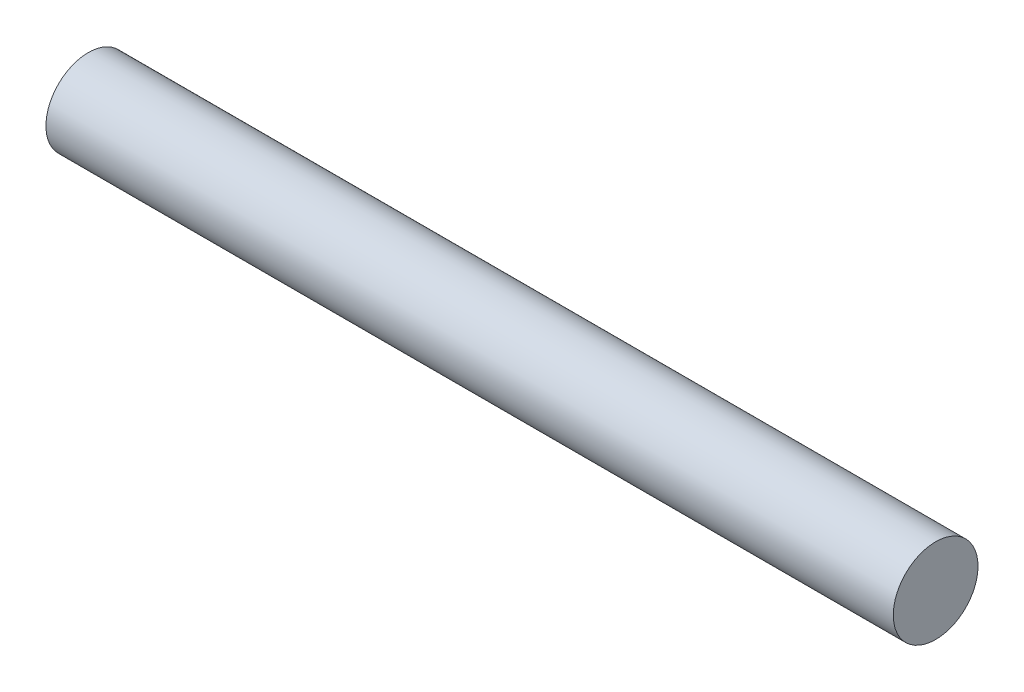
ISO-10303-21;
HEADER;
FILE_DESCRIPTION(('STEP AP214'),'2;1');
FILE_NAME('part.step','',(''),(''),'','','');
FILE_SCHEMA(('AUTOMOTIVE_DESIGN { 1 0 10303 214 1 1 1 1 }'));
ENDSEC;
DATA;
#1=APPLICATION_CONTEXT('core data for automotive mechanical design processes');
#2=APPLICATION_PROTOCOL_DEFINITION('international standard','automotive_design',2000,#1);
#3=PRODUCT_CONTEXT('',#1,'mechanical');
#4=PRODUCT('Part','Part','',(#3));
#5=PRODUCT_RELATED_PRODUCT_CATEGORY('part','',(#4));
#6=PRODUCT_DEFINITION_FORMATION('','',#4);
#7=PRODUCT_DEFINITION_CONTEXT('part definition',#1,'design');
#8=PRODUCT_DEFINITION('design','',#6,#7);
#9=PRODUCT_DEFINITION_SHAPE('','',#8);
#10=(LENGTH_UNIT() NAMED_UNIT(*) SI_UNIT(.MILLI.,.METRE.));
#11=(NAMED_UNIT(*) PLANE_ANGLE_UNIT() SI_UNIT($,.RADIAN.));
#12=(NAMED_UNIT(*) SI_UNIT($,.STERADIAN.) SOLID_ANGLE_UNIT());
#13=UNCERTAINTY_MEASURE_WITH_UNIT(LENGTH_MEASURE(1.E-05),#10,'distance_accuracy_value','');
#14=(GEOMETRIC_REPRESENTATION_CONTEXT(3) GLOBAL_UNCERTAINTY_ASSIGNED_CONTEXT((#13)) GLOBAL_UNIT_ASSIGNED_CONTEXT((#10,
#11,#12)) REPRESENTATION_CONTEXT('',''));
#15=CARTESIAN_POINT('',(0.,0.,0.));
#16=DIRECTION('',(0.,0.,1.));
#17=DIRECTION('',(1.,0.,0.));
#18=AXIS2_PLACEMENT_3D('',#15,#16,#17);
#19=CARTESIAN_POINT('',(31.75,0.,0.));
#20=DIRECTION('',(-1.,0.,0.));
#21=DIRECTION('',(0.,0.,1.));
#22=AXIS2_PLACEMENT_3D('',#19,#20,#21);
#23=CYLINDRICAL_SURFACE('',#22,1.5875);
#24=CARTESIAN_POINT('',(31.75,0.,0.));
#25=DIRECTION('',(1.,0.,0.));
#26=DIRECTION('',(0.,0.,-1.));
#27=AXIS2_PLACEMENT_3D('',#24,#25,#26);
#28=CIRCLE('',#27,1.5875);
#29=CARTESIAN_POINT('',(31.75,0.,-1.5875));
#30=VERTEX_POINT('',#29);
#31=EDGE_CURVE('E10',#30,#30,#28,.T.);
#32=ORIENTED_EDGE('',*,*,#31,.F.);
#33=EDGE_LOOP('',(#32));
#34=FACE_BOUND('',#33,.T.);
#35=CARTESIAN_POINT('',(0.,0.,0.));
#36=DIRECTION('',(1.,0.,0.));
#37=DIRECTION('',(0.,0.,-1.));
#38=AXIS2_PLACEMENT_3D('',#35,#36,#37);
#39=CIRCLE('',#38,1.5875);
#40=CARTESIAN_POINT('',(0.,0.,-1.5875));
#41=VERTEX_POINT('',#40);
#42=EDGE_CURVE('E46',#41,#41,#39,.T.);
#43=ORIENTED_EDGE('',*,*,#42,.T.);
#44=EDGE_LOOP('',(#43));
#45=FACE_BOUND('',#44,.T.);
#46=ADVANCED_FACE('F43',(#34,#45),#23,.T.);
#47=CARTESIAN_POINT('',(31.75,0.,0.));
#48=DIRECTION('',(1.,0.,0.));
#49=DIRECTION('',(0.,0.,-1.));
#50=AXIS2_PLACEMENT_3D('',#47,#48,#49);
#51=PLANE('',#50);
#52=ORIENTED_EDGE('',*,*,#31,.T.);
#53=EDGE_LOOP('',(#52));
#54=FACE_BOUND('',#53,.T.);
#55=ADVANCED_FACE('F60',(#54),#51,.T.);
#56=CARTESIAN_POINT('',(0.,0.,0.));
#57=DIRECTION('',(1.,0.,0.));
#58=DIRECTION('',(0.,0.,-1.));
#59=AXIS2_PLACEMENT_3D('',#56,#57,#58);
#60=PLANE('',#59);
#61=ORIENTED_EDGE('',*,*,#42,.F.);
#62=EDGE_LOOP('',(#61));
#63=FACE_BOUND('',#62,.T.);
#64=ADVANCED_FACE('F58',(#63),#60,.F.);
#65=CLOSED_SHELL('',(#46,#55,#64));
#66=MANIFOLD_SOLID_BREP('B2',#65);
#67=ADVANCED_BREP_SHAPE_REPRESENTATION('',(#18,#66),#14);
#68=SHAPE_DEFINITION_REPRESENTATION(#9,#67);
ENDSEC;
END-ISO-10303-21;
